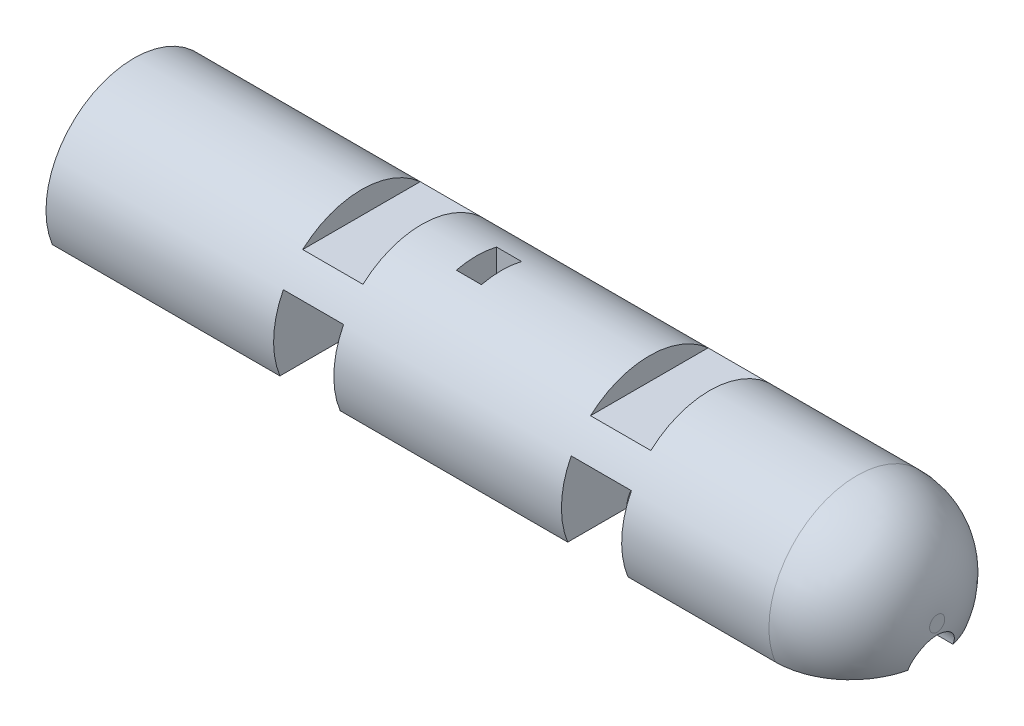
ISO-10303-21;
HEADER;
FILE_DESCRIPTION(('STEP AP214'),'2;1');
FILE_NAME('part.step','',(''),(''),'','','');
FILE_SCHEMA(('AUTOMOTIVE_DESIGN { 1 0 10303 214 1 1 1 1 }'));
ENDSEC;
DATA;
#1=APPLICATION_CONTEXT('core data for automotive mechanical design processes');
#2=APPLICATION_PROTOCOL_DEFINITION('international standard','automotive_design',2000,#1);
#3=PRODUCT_CONTEXT('',#1,'mechanical');
#4=PRODUCT('Part','Part','',(#3));
#5=PRODUCT_RELATED_PRODUCT_CATEGORY('part','',(#4));
#6=PRODUCT_DEFINITION_FORMATION('','',#4);
#7=PRODUCT_DEFINITION_CONTEXT('part definition',#1,'design');
#8=PRODUCT_DEFINITION('design','',#6,#7);
#9=PRODUCT_DEFINITION_SHAPE('','',#8);
#10=(LENGTH_UNIT() NAMED_UNIT(*) SI_UNIT(.MILLI.,.METRE.));
#11=(NAMED_UNIT(*) PLANE_ANGLE_UNIT() SI_UNIT($,.RADIAN.));
#12=(NAMED_UNIT(*) SI_UNIT($,.STERADIAN.) SOLID_ANGLE_UNIT());
#13=UNCERTAINTY_MEASURE_WITH_UNIT(LENGTH_MEASURE(1.E-05),#10,'distance_accuracy_value','');
#14=(GEOMETRIC_REPRESENTATION_CONTEXT(3) GLOBAL_UNCERTAINTY_ASSIGNED_CONTEXT((#13)) GLOBAL_UNIT_ASSIGNED_CONTEXT((#10,
#11,#12)) REPRESENTATION_CONTEXT('',''));
#15=CARTESIAN_POINT('',(0.,0.,0.));
#16=DIRECTION('',(0.,0.,1.));
#17=DIRECTION('',(1.,0.,0.));
#18=AXIS2_PLACEMENT_3D('',#15,#16,#17);
#19=CARTESIAN_POINT('',(0.,5.5,0.));
#20=DIRECTION('',(0.,1.,0.));
#21=DIRECTION('',(0.,0.,1.));
#22=AXIS2_PLACEMENT_3D('',#19,#20,#21);
#23=PLANE('',#22);
#24=DIRECTION('',(-1.,0.,0.));
#25=VECTOR('',#24,1.);
#26=CARTESIAN_POINT('',(80.01,5.5,6.51005000055557));
#27=LINE('',#26,#25);
#28=CARTESIAN_POINT('',(28.67,5.5,6.51005000055557));
#29=VERTEX_POINT('',#28);
#30=CARTESIAN_POINT('',(51.34,5.5,6.51005000055557));
#31=VERTEX_POINT('',#30);
#32=EDGE_CURVE('E269',#29,#31,#27,.F.);
#33=ORIENTED_EDGE('',*,*,#32,.F.);
#34=DIRECTION('',(0.,0.,1.));
#35=VECTOR('',#34,1.);
#36=CARTESIAN_POINT('',(28.67,5.5,17.52));
#37=LINE('',#36,#35);
#38=CARTESIAN_POINT('',(28.67,5.5,0.634581549236986));
#39=VERTEX_POINT('',#38);
#40=EDGE_CURVE('E272',#39,#29,#37,.T.);
#41=ORIENTED_EDGE('',*,*,#40,.F.);
#42=DIRECTION('',(-1.,0.,0.));
#43=VECTOR('',#42,1.);
#44=CARTESIAN_POINT('',(80.01,5.5,0.634581549236986));
#45=LINE('',#44,#43);
#46=CARTESIAN_POINT('',(51.34,5.5,0.634581549236986));
#47=VERTEX_POINT('',#46);
#48=EDGE_CURVE('E211',#39,#47,#45,.F.);
#49=ORIENTED_EDGE('',*,*,#48,.T.);
#50=DIRECTION('',(0.,0.,-1.));
#51=VECTOR('',#50,1.);
#52=CARTESIAN_POINT('',(51.34,5.5,17.52));
#53=LINE('',#52,#51);
#54=EDGE_CURVE('E274',#31,#47,#53,.T.);
#55=ORIENTED_EDGE('',*,*,#54,.F.);
#56=EDGE_LOOP('',(#33,#41,#49,#55));
#57=FACE_BOUND('',#56,.T.);
#58=ADVANCED_FACE('F42',(#57),#23,.F.);
#59=DIRECTION('',(-1.,0.,0.));
#60=VECTOR('',#59,1.);
#61=CARTESIAN_POINT('',(80.01,5.5,16.885418450763));
#62=LINE('',#61,#60);
#63=CARTESIAN_POINT('',(51.34,5.5,16.885418450763));
#64=VERTEX_POINT('',#63);
#65=CARTESIAN_POINT('',(28.67,5.5,16.885418450763));
#66=VERTEX_POINT('',#65);
#67=EDGE_CURVE('E407',#64,#66,#62,.T.);
#68=ORIENTED_EDGE('',*,*,#67,.T.);
#69=CARTESIAN_POINT('',(28.67,5.5,11.0099499994444));
#70=VERTEX_POINT('',#69);
#71=EDGE_CURVE('E320',#70,#66,#37,.T.);
#72=ORIENTED_EDGE('',*,*,#71,.F.);
#73=DIRECTION('',(-1.,0.,0.));
#74=VECTOR('',#73,1.);
#75=CARTESIAN_POINT('',(80.01,5.5,11.0099499994444));
#76=LINE('',#75,#74);
#77=CARTESIAN_POINT('',(51.34,5.5,11.0099499994444));
#78=VERTEX_POINT('',#77);
#79=EDGE_CURVE('E278',#78,#70,#76,.T.);
#80=ORIENTED_EDGE('',*,*,#79,.F.);
#81=EDGE_CURVE('E400',#64,#78,#53,.T.);
#82=ORIENTED_EDGE('',*,*,#81,.F.);
#83=EDGE_LOOP('',(#68,#72,#80,#82));
#84=FACE_BOUND('',#83,.T.);
#85=ADVANCED_FACE('F259',(#84),#23,.F.);
#86=CARTESIAN_POINT('',(22.67,5.5,16.885418450763));
#87=VERTEX_POINT('',#86);
#88=CARTESIAN_POINT('',(0.,5.5,16.885418450763));
#89=VERTEX_POINT('',#88);
#90=EDGE_CURVE('E47',#87,#89,#62,.T.);
#91=ORIENTED_EDGE('',*,*,#90,.T.);
#92=DIRECTION('',(0.,0.,-1.));
#93=VECTOR('',#92,1.);
#94=CARTESIAN_POINT('',(0.,5.5,17.52));
#95=LINE('',#94,#93);
#96=CARTESIAN_POINT('',(0.,5.5,0.634581549236986));
#97=VERTEX_POINT('',#96);
#98=EDGE_CURVE('E315',#89,#97,#95,.T.);
#99=ORIENTED_EDGE('',*,*,#98,.T.);
#100=CARTESIAN_POINT('',(22.67,5.5,0.634581549236986));
#101=VERTEX_POINT('',#100);
#102=EDGE_CURVE('E214',#97,#101,#45,.F.);
#103=ORIENTED_EDGE('',*,*,#102,.T.);
#104=DIRECTION('',(0.,0.,-1.));
#105=VECTOR('',#104,1.);
#106=CARTESIAN_POINT('',(22.67,5.5,17.52));
#107=LINE('',#106,#105);
#108=EDGE_CURVE('E318',#87,#101,#107,.T.);
#109=ORIENTED_EDGE('',*,*,#108,.F.);
#110=EDGE_LOOP('',(#91,#99,#103,#109));
#111=FACE_BOUND('',#110,.T.);
#112=ADVANCED_FACE('F264',(#111),#23,.F.);
#113=CARTESIAN_POINT('',(57.34,5.5,0.634581549236986));
#114=VERTEX_POINT('',#113);
#115=CARTESIAN_POINT('',(72.01,5.5,0.634581549236986));
#116=VERTEX_POINT('',#115);
#117=EDGE_CURVE('E206',#114,#116,#45,.F.);
#118=ORIENTED_EDGE('',*,*,#117,.T.);
#119=CARTESIAN_POINT('',(79.6076953742566,5.5,8.76));
#120=CARTESIAN_POINT('',(79.6077023309361,5.5,9.02837036371126));
#121=CARTESIAN_POINT('',(79.5968199968479,5.5,9.29679003492493));
#122=CARTESIAN_POINT('',(79.5527067564648,5.5,9.83186942900327));
#123=CARTESIAN_POINT('',(79.5194697068977,5.5,10.0985286477334));
#124=CARTESIAN_POINT('',(79.4294253808811,5.5,10.6277164957013));
#125=CARTESIAN_POINT('',(79.3726328725868,5.5,10.8902476062178));
#126=CARTESIAN_POINT('',(79.2344893147,5.5,11.4087351942514));
#127=CARTESIAN_POINT('',(79.1531466228046,5.5,11.6646938771143));
#128=CARTESIAN_POINT('',(78.983013750841,5.5,12.1205827524817));
#129=CARTESIAN_POINT('',(78.8984169333496,5.5,12.322085331011));
#130=CARTESIAN_POINT('',(78.7128787031022,5.5,12.7174152992263));
#131=CARTESIAN_POINT('',(78.6119392085858,5.5,12.9112435863717));
#132=CARTESIAN_POINT('',(78.3941329563667,5.5,13.2897037175507));
#133=CARTESIAN_POINT('',(78.2772684806355,5.5,13.4743368740348));
#134=CARTESIAN_POINT('',(78.0282333109941,5.5,13.8329879390141));
#135=CARTESIAN_POINT('',(77.8960623306653,5.5,14.0070056487777));
#136=CARTESIAN_POINT('',(77.6169989223127,5.5,14.3433346771138));
#137=CARTESIAN_POINT('',(77.4700808258599,5.5,14.5056247081087));
#138=CARTESIAN_POINT('',(77.1627255165891,5.5,14.8168525951596));
#139=CARTESIAN_POINT('',(77.0022885637375,5.5,14.9657907078582));
#140=CARTESIAN_POINT('',(76.6690279456885,5.5,15.2491323274769));
#141=CARTESIAN_POINT('',(76.4962031277762,5.5,15.3835344788708));
#142=CARTESIAN_POINT('',(76.1394587439955,5.5,15.6367021013726));
#143=CARTESIAN_POINT('',(75.9555394586154,5.5,15.7554679675529));
#144=CARTESIAN_POINT('',(75.5840728801009,5.5,15.9728482304509));
#145=CARTESIAN_POINT('',(75.3968329147818,5.5,16.0719882105933));
#146=CARTESIAN_POINT('',(75.0145293293788,5.5,16.2540097603268));
#147=CARTESIAN_POINT('',(74.8194630805038,5.5,16.3368858109749));
#148=CARTESIAN_POINT('',(74.4230730165867,5.5,16.4856718983966));
#149=CARTESIAN_POINT('',(74.2217523050191,5.5,16.5515902035644));
#150=CARTESIAN_POINT('',(73.8141457797776,5.5,16.6660363181715));
#151=CARTESIAN_POINT('',(73.6078581681981,5.5,16.7145577261799));
#152=CARTESIAN_POINT('',(73.1942612379451,5.5,16.793357429692));
#153=CARTESIAN_POINT('',(72.9869902324859,5.5,16.8238369612243));
#154=CARTESIAN_POINT('',(72.570536297232,5.5,16.8671893941509));
#155=CARTESIAN_POINT('',(72.3613526861674,5.5,16.8800557545266));
#156=CARTESIAN_POINT('',(71.9427338287219,5.5,16.8880634521312));
#157=CARTESIAN_POINT('',(71.7332987231721,5.5,16.8832121586811));
#158=CARTESIAN_POINT('',(71.3154920568877,5.5,16.8558307089543));
#159=CARTESIAN_POINT('',(71.107121019827,5.5,16.83329256052));
#160=CARTESIAN_POINT('',(70.6936025917873,5.5,16.7707815713613));
#161=CARTESIAN_POINT('',(70.4884478643462,5.5,16.7308572466667));
#162=CARTESIAN_POINT('',(70.0823202610352,5.5,16.6339003685537));
#163=CARTESIAN_POINT('',(69.8813455343825,5.5,16.5768755669352));
#164=CARTESIAN_POINT('',(69.4848316335242,5.5,16.4461077068488));
#165=CARTESIAN_POINT('',(69.2892944258595,5.5,16.3723586859316));
#166=CARTESIAN_POINT('',(68.9051771189548,5.5,16.2087273027153));
#167=CARTESIAN_POINT('',(68.7165944904671,5.5,16.1188508768105));
#168=CARTESIAN_POINT('',(68.347239393529,5.5,15.9234025387041));
#169=CARTESIAN_POINT('',(68.1664841552859,5.5,15.8177980672832));
#170=CARTESIAN_POINT('',(67.8145236883116,5.5,15.5918543659582));
#171=CARTESIAN_POINT('',(67.6433150611271,5.5,15.4715204289025));
#172=CARTESIAN_POINT('',(67.3114651731751,5.5,15.2169123290138));
#173=CARTESIAN_POINT('',(67.1508291625498,5.5,15.0826313244176));
#174=CARTESIAN_POINT('',(66.8413450962586,5.5,14.8012177565938));
#175=CARTESIAN_POINT('',(66.6924929654953,5.5,14.6540896734813));
#176=CARTESIAN_POINT('',(66.4062408461907,5.5,14.3466972848664));
#177=CARTESIAN_POINT('',(66.2689511346516,5.5,14.1863303002828));
#178=CARTESIAN_POINT('',(66.0081338510629,5.5,13.8547765902544));
#179=CARTESIAN_POINT('',(65.8846062623249,5.5,13.6835898779304));
#180=CARTESIAN_POINT('',(65.6520782342032,5.5,13.3317624329755));
#181=CARTESIAN_POINT('',(65.5430697318146,5.5,13.1511270258507));
#182=CARTESIAN_POINT('',(65.3400205895639,5.5,12.7816372852848));
#183=CARTESIAN_POINT('',(65.2459801640461,5.5,12.5927828341954));
#184=CARTESIAN_POINT('',(65.0708865856775,5.5,12.2030979503389));
#185=CARTESIAN_POINT('',(64.9902453279674,5.5,12.0020825936391));
#186=CARTESIAN_POINT('',(64.8451581363816,5.5,11.5943073668426));
#187=CARTESIAN_POINT('',(64.7807121686357,5.5,11.3875475087607));
#188=CARTESIAN_POINT('',(64.6677422936703,5.5,10.9694893295982));
#189=CARTESIAN_POINT('',(64.6192364400913,5.5,10.7581861492807));
#190=CARTESIAN_POINT('',(64.5377591243811,5.5,10.3326116361911));
#191=CARTESIAN_POINT('',(64.504788962277,5.5,10.1183400565673));
#192=CARTESIAN_POINT('',(64.4511250633583,5.5,9.66600848738885));
#193=CARTESIAN_POINT('',(64.4320336620135,5.5,9.42775885013463));
#194=CARTESIAN_POINT('',(64.4112355544718,5.5,8.950497483218));
#195=CARTESIAN_POINT('',(64.4095305259844,5.5,8.71148568223609));
#196=CARTESIAN_POINT('',(64.4234356959219,5.5,8.23385032167484));
#197=CARTESIAN_POINT('',(64.4390533936272,5.5,7.99522697506655));
#198=CARTESIAN_POINT('',(64.4882326155228,5.5,7.51982110574651));
#199=CARTESIAN_POINT('',(64.5217941617526,5.5,7.28303858529612));
#200=CARTESIAN_POINT('',(64.6136406387275,5.5,6.78064967739285));
#201=CARTESIAN_POINT('',(64.674682353132,5.5,6.51553765491161));
#202=CARTESIAN_POINT('',(64.8220773784337,5.5,5.99238154436173));
#203=CARTESIAN_POINT('',(64.9084329751479,5.5,5.73433809687986));
#204=CARTESIAN_POINT('',(65.1065802623455,5.5,5.22855696072308));
#205=CARTESIAN_POINT('',(65.2183393370527,5.5,4.98080653500178));
#206=CARTESIAN_POINT('',(65.4669030781019,5.5,4.49821469081062));
#207=CARTESIAN_POINT('',(65.6037033261558,5.5,4.26337100455301));
#208=CARTESIAN_POINT('',(65.878747243824,5.5,3.84380922373616));
#209=CARTESIAN_POINT('',(66.0136381698243,5.5,3.65688444817034));
#210=CARTESIAN_POINT('',(66.2997775509953,5.5,3.29600676983187));
#211=CARTESIAN_POINT('',(66.451024603721,5.5,3.12205275704747));
#212=CARTESIAN_POINT('',(66.7687670735896,5.5,2.78864161133379));
#213=CARTESIAN_POINT('',(66.9352641855355,5.5,2.6291860936165));
#214=CARTESIAN_POINT('',(67.2821807842605,5.5,2.32621389276423));
#215=CARTESIAN_POINT('',(67.4625998136151,5.5,2.18269668633075));
#216=CARTESIAN_POINT('',(67.8220794013123,5.5,1.92285940096926));
#217=CARTESIAN_POINT('',(68.0002554609646,5.5,1.80531333047753));
#218=CARTESIAN_POINT('',(68.3660042895672,5.5,1.58589093529027));
#219=CARTESIAN_POINT('',(68.5535766383489,5.5,1.48401391075836));
#220=CARTESIAN_POINT('',(68.9366936647261,5.5,1.29674316231642));
#221=CARTESIAN_POINT('',(69.1322354926056,5.5,1.21134360797376));
#222=CARTESIAN_POINT('',(69.5299283138085,5.5,1.05763694765287));
#223=CARTESIAN_POINT('',(69.7320793303315,5.5,0.989329901679742));
#224=CARTESIAN_POINT('',(70.138166052646,5.5,0.871302987910124));
#225=CARTESIAN_POINT('',(70.3420191294219,5.5,0.821298631703383));
#226=CARTESIAN_POINT('',(70.7532958124504,5.5,0.738695237554467));
#227=CARTESIAN_POINT('',(70.9607206183616,5.5,0.706102170182909));
#228=CARTESIAN_POINT('',(71.3775197773859,5.5,0.658597737653936));
#229=CARTESIAN_POINT('',(71.586893506247,5.5,0.643680894651801));
#230=CARTESIAN_POINT('',(72.0062300275939,5.5,0.631619167096186));
#231=CARTESIAN_POINT('',(72.2161930088503,5.5,0.634480838940165));
#232=CARTESIAN_POINT('',(72.6341203636616,5.5,0.657913888133056));
#233=CARTESIAN_POINT('',(72.8420894932414,5.5,0.678400544248534));
#234=CARTESIAN_POINT('',(73.2556400806789,5.5,0.736830146422631));
#235=CARTESIAN_POINT('',(73.461220620769,5.5,0.774779588697626));
#236=CARTESIAN_POINT('',(73.8683617984528,5.5,0.86783577784102));
#237=CARTESIAN_POINT('',(74.0699242289981,5.5,0.922934681317626));
#238=CARTESIAN_POINT('',(74.4677902227804,5.5,1.04991817969198));
#239=CARTESIAN_POINT('',(74.6640913713373,5.5,1.12181033967495));
#240=CARTESIAN_POINT('',(75.0500604968501,5.5,1.28187986833122));
#241=CARTESIAN_POINT('',(75.2397248589599,5.5,1.37006595249154));
#242=CARTESIAN_POINT('',(75.6108980372724,5.5,1.56200434622037));
#243=CARTESIAN_POINT('',(75.792410448237,5.5,1.66574970527858));
#244=CARTESIAN_POINT('',(76.1461865005296,5.5,1.8881182409424));
#245=CARTESIAN_POINT('',(76.3184462108656,5.5,2.00674767072656));
#246=CARTESIAN_POINT('',(76.6523963730252,5.5,2.25793041989117));
#247=CARTESIAN_POINT('',(76.8140905887795,5.5,2.39047873634663));
#248=CARTESIAN_POINT('',(77.1268758837295,5.5,2.66943382448424));
#249=CARTESIAN_POINT('',(77.2778940126476,5.5,2.8159223858914));
#250=CARTESIAN_POINT('',(77.5671613024183,5.5,3.12090630836931));
#251=CARTESIAN_POINT('',(77.7054148244894,5.5,3.27939753461002));
#252=CARTESIAN_POINT('',(77.9683921606876,5.5,3.60730864427168));
#253=CARTESIAN_POINT('',(78.0931118157995,5.5,3.77673186177828));
#254=CARTESIAN_POINT('',(78.3282223198821,5.5,4.12515830649314));
#255=CARTESIAN_POINT('',(78.4386177297412,5.5,4.30415845860804));
#256=CARTESIAN_POINT('',(78.6466065165115,5.5,4.67407731785711));
#257=CARTESIAN_POINT('',(78.7439066423087,5.5,4.86516084157995));
#258=CARTESIAN_POINT('',(78.9227413170203,5.5,5.25456166631871));
#259=CARTESIAN_POINT('',(79.0042753453133,5.5,5.45287920595627));
#260=CARTESIAN_POINT('',(79.1514241647374,5.5,5.85519641806213));
#261=CARTESIAN_POINT('',(79.2170482246808,5.5,6.05919270460763));
#262=CARTESIAN_POINT('',(79.3325966782146,5.5,6.47151996653132));
#263=CARTESIAN_POINT('',(79.3825225664344,5.5,6.67985052722657));
#264=CARTESIAN_POINT('',(79.4867765579149,5.5,7.19709082030436));
#265=CARTESIAN_POINT('',(79.5323912371054,5.5,7.50780060457313));
#266=CARTESIAN_POINT('',(79.5777172244861,5.5,7.97606786034412));
#267=CARTESIAN_POINT('',(79.5889763225878,5.5,8.1326347839779));
#268=CARTESIAN_POINT('',(79.6039631498456,5.5,8.44612886471213));
#269=CARTESIAN_POINT('',(79.6076913059642,5.5,8.60305600088548));
#270=CARTESIAN_POINT('',(79.6076953742566,5.5,8.76));
#271=B_SPLINE_CURVE_WITH_KNOTS('',3,(#119,#120,#121,#122,#123,#124,#125,#126,#127,#128,#129,
#130,#131,#132,#133,#134,#135,#136,#137,#138,#139,#140,#141,#142,#143,#144,#145,#146,#147,#148,
#149,#150,#151,#152,#153,#154,#155,#156,#157,#158,#159,#160,#161,#162,#163,#164,#165,#166,#167,
#168,#169,#170,#171,#172,#173,#174,#175,#176,#177,#178,#179,#180,#181,#182,#183,#184,#185,#186,
#187,#188,#189,#190,#191,#192,#193,#194,#195,#196,#197,#198,#199,#200,#201,#202,#203,#204,#205,
#206,#207,#208,#209,#210,#211,#212,#213,#214,#215,#216,#217,#218,#219,#220,#221,#222,#223,#224,
#225,#226,#227,#228,#229,#230,#231,#232,#233,#234,#235,#236,#237,#238,#239,#240,#241,#242,#243,
#244,#245,#246,#247,#248,#249,#250,#251,#252,#253,#254,#255,#256,#257,#258,#259,#260,#261,#262,
#263,#264,#265,#266,#267,#268,#269,#270),.UNSPECIFIED.,.T.,.F.,(4,2,2,2,2,2,2,2,2,2,2,2,2,2,2,2,
2,2,2,2,2,2,2,2,2,2,2,2,2,2,2,2,2,2,2,2,2,2,2,2,2,2,2,2,2,2,2,2,2,2,2,2,2,2,2,2,2,2,2,2,2,2,2,2,
2,2,2,2,2,2,2,2,2,2,2,4),(0.,0.80496675937522,1.61015482112021,2.41483882939646,
3.21924920494103,3.87416733633762,4.52900865165891,5.1837562299196,5.83851606193625,
6.49443599233153,7.15034331232582,7.80631174519797,8.46226360093292,9.09710181674111,
9.73215508516452,10.3668981197933,11.0018744778508,11.6296280228386,12.2576146340159,
12.8853400758669,13.5133493314057,14.1396172488814,14.7656017015312,15.3918096794026,
16.0177876252193,16.6450799225662,17.2721474684102,17.8995240895493,18.5266827950546,
19.1592699321369,19.7918563021188,20.42408989476,21.0563325402399,21.7053891303664,
22.3544443630746,23.0042321969112,23.6540743953655,24.3704437794031,25.0868822893209,
25.8036310778276,26.5203807466862,27.3353065022412,28.1503058674153,28.9642646987922,
29.7780800526985,30.4687126265365,31.1592860294354,31.8499362719834,32.5405638318812,
33.1801653827535,33.8197383584015,34.4590846091132,35.0984331042873,35.7273732740088,
36.3565289777532,36.9854896557249,37.6146822968808,38.2408672745985,38.867285383828,
39.493417417545,40.1198320592468,40.7465827401491,41.3730542735476,41.9997898905393,
42.6263010033743,43.2567458928364,43.8869745780511,44.5173963900285,45.1476169783934,
45.7901870119126,46.4327782604829,47.0749942444751,47.7171490642893,48.6573740877274,
49.1281483703442,49.5988959619319),.UNSPECIFIED.);
#272=CARTESIAN_POINT('',(79.3394800276012,5.50000000000008,6.51005000055557));
#273=VERTEX_POINT('',#272);
#274=EDGE_CURVE('E193',#116,#273,#271,.T.);
#275=ORIENTED_EDGE('',*,*,#274,.T.);
#276=DIRECTION('',(-1.,0.,0.));
#277=VECTOR('',#276,1.);
#278=CARTESIAN_POINT('',(80.01,5.5,6.51005000055557));
#279=LINE('',#278,#277);
#280=CARTESIAN_POINT('',(57.34,5.5,6.51005000055557));
#281=VERTEX_POINT('',#280);
#282=EDGE_CURVE('E319',#281,#273,#279,.F.);
#283=ORIENTED_EDGE('',*,*,#282,.F.);
#284=DIRECTION('',(0.,0.,1.));
#285=VECTOR('',#284,1.);
#286=CARTESIAN_POINT('',(57.34,5.5,17.52));
#287=LINE('',#286,#285);
#288=EDGE_CURVE('E208',#114,#281,#287,.T.);
#289=ORIENTED_EDGE('',*,*,#288,.F.);
#290=EDGE_LOOP('',(#118,#275,#283,#289));
#291=FACE_BOUND('',#290,.T.);
#292=ADVANCED_FACE('F207',(#291),#23,.F.);
#293=CARTESIAN_POINT('',(72.01,5.5,16.885418450763));
#294=VERTEX_POINT('',#293);
#295=CARTESIAN_POINT('',(57.34,5.5,16.885418450763));
#296=VERTEX_POINT('',#295);
#297=EDGE_CURVE('E212',#294,#296,#62,.T.);
#298=ORIENTED_EDGE('',*,*,#297,.T.);
#299=CARTESIAN_POINT('',(57.34,5.5,11.0099499994444));
#300=VERTEX_POINT('',#299);
#301=EDGE_CURVE('E401',#300,#296,#287,.T.);
#302=ORIENTED_EDGE('',*,*,#301,.F.);
#303=DIRECTION('',(-1.,0.,0.));
#304=VECTOR('',#303,1.);
#305=CARTESIAN_POINT('',(80.01,5.5,11.0099499994444));
#306=LINE('',#305,#304);
#307=CARTESIAN_POINT('',(79.3394800276087,5.50000000002092,11.0099499994446));
#308=VERTEX_POINT('',#307);
#309=EDGE_CURVE('E295',#308,#300,#306,.T.);
#310=ORIENTED_EDGE('',*,*,#309,.F.);
#311=EDGE_CURVE('E203',#308,#294,#271,.T.);
#312=ORIENTED_EDGE('',*,*,#311,.T.);
#313=EDGE_LOOP('',(#298,#302,#310,#312));
#314=FACE_BOUND('',#313,.T.);
#315=ADVANCED_FACE('F239',(#314),#23,.F.);
#316=CARTESIAN_POINT('',(51.34,15.27,17.52));
#317=DIRECTION('',(-1.,0.,0.));
#318=DIRECTION('',(0.,0.,1.));
#319=AXIS2_PLACEMENT_3D('',#316,#317,#318);
#320=PLANE('',#319);
#321=CARTESIAN_POINT('',(51.34,8.76,8.76));
#322=DIRECTION('',(-1.,0.,0.));
#323=DIRECTION('',(0.,0.,1.));
#324=AXIS2_PLACEMENT_3D('',#321,#322,#323);
#325=CIRCLE('',#324,8.755);
#326=CARTESIAN_POINT('',(51.34,15.27,14.6140520154847));
#327=VERTEX_POINT('',#326);
#328=CARTESIAN_POINT('',(51.34,15.27,2.90594798451533));
#329=VERTEX_POINT('',#328);
#330=EDGE_CURVE('E341',#327,#329,#325,.T.);
#331=ORIENTED_EDGE('',*,*,#330,.F.);
#332=DIRECTION('',(0.,0.,-1.));
#333=VECTOR('',#332,1.);
#334=CARTESIAN_POINT('',(51.34,15.27,17.52));
#335=LINE('',#334,#333);
#336=EDGE_CURVE('E382',#327,#329,#335,.T.);
#337=ORIENTED_EDGE('',*,*,#336,.T.);
#338=EDGE_LOOP('',(#331,#337));
#339=FACE_BOUND('',#338,.T.);
#340=ADVANCED_FACE('F243',(#339),#320,.F.);
#341=CARTESIAN_POINT('',(51.34,15.27,17.52));
#342=DIRECTION('',(0.,1.,0.));
#343=DIRECTION('',(0.,0.,1.));
#344=AXIS2_PLACEMENT_3D('',#341,#342,#343);
#345=PLANE('',#344);
#346=DIRECTION('',(0.,0.,-1.));
#347=VECTOR('',#346,1.);
#348=CARTESIAN_POINT('',(57.34,15.27,17.52));
#349=LINE('',#348,#347);
#350=CARTESIAN_POINT('',(57.34,15.27,14.6140520154847));
#351=VERTEX_POINT('',#350);
#352=CARTESIAN_POINT('',(57.34,15.27,2.90594798451533));
#353=VERTEX_POINT('',#352);
#354=EDGE_CURVE('E379',#351,#353,#349,.T.);
#355=ORIENTED_EDGE('',*,*,#354,.T.);
#356=DIRECTION('',(-1.,0.,0.));
#357=VECTOR('',#356,1.);
#358=CARTESIAN_POINT('',(80.01,15.27,2.90594798451533));
#359=LINE('',#358,#357);
#360=EDGE_CURVE('E346',#353,#329,#359,.T.);
#361=ORIENTED_EDGE('',*,*,#360,.T.);
#362=ORIENTED_EDGE('',*,*,#336,.F.);
#363=DIRECTION('',(-1.,0.,0.));
#364=VECTOR('',#363,1.);
#365=CARTESIAN_POINT('',(80.01,15.27,14.6140520154847));
#366=LINE('',#365,#364);
#367=EDGE_CURVE('E343',#327,#351,#366,.F.);
#368=ORIENTED_EDGE('',*,*,#367,.T.);
#369=EDGE_LOOP('',(#355,#361,#362,#368));
#370=FACE_BOUND('',#369,.T.);
#371=ADVANCED_FACE('F481',(#370),#345,.T.);
#372=CARTESIAN_POINT('',(57.34,17.52,17.52));
#373=DIRECTION('',(1.,0.,0.));
#374=DIRECTION('',(0.,0.,-1.));
#375=AXIS2_PLACEMENT_3D('',#372,#373,#374);
#376=PLANE('',#375);
#377=CARTESIAN_POINT('',(57.34,8.76,8.76));
#378=DIRECTION('',(1.,0.,0.));
#379=DIRECTION('',(0.,0.,-1.));
#380=AXIS2_PLACEMENT_3D('',#377,#378,#379);
#381=CIRCLE('',#380,8.755);
#382=EDGE_CURVE('E349',#353,#351,#381,.T.);
#383=ORIENTED_EDGE('',*,*,#382,.F.);
#384=ORIENTED_EDGE('',*,*,#354,.F.);
#385=EDGE_LOOP('',(#383,#384));
#386=FACE_BOUND('',#385,.T.);
#387=ADVANCED_FACE('F484',(#386),#376,.F.);
#388=CARTESIAN_POINT('',(22.67,17.52,17.52));
#389=DIRECTION('',(1.,0.,0.));
#390=DIRECTION('',(0.,1.,0.));
#391=AXIS2_PLACEMENT_3D('',#388,#389,#390);
#392=PLANE('',#391);
#393=DIRECTION('',(0.,0.,-1.));
#394=VECTOR('',#393,1.);
#395=CARTESIAN_POINT('',(22.67,15.27,17.52));
#396=LINE('',#395,#394);
#397=CARTESIAN_POINT('',(22.67,15.27,14.6140520154847));
#398=VERTEX_POINT('',#397);
#399=CARTESIAN_POINT('',(22.67,15.27,2.90594798451534));
#400=VERTEX_POINT('',#399);
#401=EDGE_CURVE('E314',#398,#400,#396,.T.);
#402=ORIENTED_EDGE('',*,*,#401,.T.);
#403=CARTESIAN_POINT('',(22.67,8.76,8.76));
#404=DIRECTION('',(1.,0.,0.));
#405=DIRECTION('',(0.,1.,0.));
#406=AXIS2_PLACEMENT_3D('',#403,#404,#405);
#407=CIRCLE('',#406,8.755);
#408=EDGE_CURVE('E220',#400,#398,#407,.T.);
#409=ORIENTED_EDGE('',*,*,#408,.T.);
#410=EDGE_LOOP('',(#402,#409));
#411=FACE_BOUND('',#410,.T.);
#412=ADVANCED_FACE('F473',(#411),#392,.T.);
#413=CARTESIAN_POINT('',(22.67,15.27,17.52));
#414=DIRECTION('',(0.,1.,0.));
#415=DIRECTION('',(-1.,0.,0.));
#416=AXIS2_PLACEMENT_3D('',#413,#414,#415);
#417=PLANE('',#416);
#418=DIRECTION('',(0.,0.,-1.));
#419=VECTOR('',#418,1.);
#420=CARTESIAN_POINT('',(28.67,15.27,17.52));
#421=LINE('',#420,#419);
#422=CARTESIAN_POINT('',(28.67,15.27,14.6140520154846));
#423=VERTEX_POINT('',#422);
#424=CARTESIAN_POINT('',(28.67,15.27,2.90594798451536));
#425=VERTEX_POINT('',#424);
#426=EDGE_CURVE('E385',#423,#425,#421,.T.);
#427=ORIENTED_EDGE('',*,*,#426,.T.);
#428=DIRECTION('',(-1.,0.,0.));
#429=VECTOR('',#428,1.);
#430=CARTESIAN_POINT('',(80.01,15.27,2.90594798451536));
#431=LINE('',#430,#429);
#432=EDGE_CURVE('E336',#425,#400,#431,.T.);
#433=ORIENTED_EDGE('',*,*,#432,.T.);
#434=ORIENTED_EDGE('',*,*,#401,.F.);
#435=DIRECTION('',(-1.,0.,0.));
#436=VECTOR('',#435,1.);
#437=CARTESIAN_POINT('',(80.01,15.27,14.6140520154846));
#438=LINE('',#437,#436);
#439=EDGE_CURVE('E304',#398,#423,#438,.F.);
#440=ORIENTED_EDGE('',*,*,#439,.T.);
#441=EDGE_LOOP('',(#427,#433,#434,#440));
#442=FACE_BOUND('',#441,.T.);
#443=ADVANCED_FACE('F459',(#442),#417,.T.);
#444=CARTESIAN_POINT('',(28.67,17.52,17.52));
#445=DIRECTION('',(1.,0.,0.));
#446=DIRECTION('',(0.,0.,-1.));
#447=AXIS2_PLACEMENT_3D('',#444,#445,#446);
#448=PLANE('',#447);
#449=CARTESIAN_POINT('',(28.67,8.76,8.76));
#450=DIRECTION('',(1.,0.,0.));
#451=DIRECTION('',(0.,0.,-1.));
#452=AXIS2_PLACEMENT_3D('',#449,#450,#451);
#453=CIRCLE('',#452,8.755);
#454=EDGE_CURVE('E339',#425,#423,#453,.T.);
#455=ORIENTED_EDGE('',*,*,#454,.F.);
#456=ORIENTED_EDGE('',*,*,#426,.F.);
#457=EDGE_LOOP('',(#455,#456));
#458=FACE_BOUND('',#457,.T.);
#459=ADVANCED_FACE('F455',(#458),#448,.F.);
#460=CARTESIAN_POINT('',(36.6138540259674,17.515,10.7590520154847));
#461=DIRECTION('',(-1.,0.,0.));
#462=DIRECTION('',(0.,0.,1.));
#463=AXIS2_PLACEMENT_3D('',#460,#461,#462);
#464=PLANE('',#463);
#465=DIRECTION('',(0.,-1.,0.));
#466=VECTOR('',#465,1.);
#467=CARTESIAN_POINT('',(36.6138540259674,17.515,6.75905201548466));
#468=LINE('',#467,#466);
#469=CARTESIAN_POINT('',(36.6138540259674,17.2832759056166,6.75905201548466));
#470=VERTEX_POINT('',#469);
#471=CARTESIAN_POINT('',(36.6138540259674,6.54393496551727,6.75905201548466));
#472=VERTEX_POINT('',#471);
#473=EDGE_CURVE('E11',#470,#472,#468,.T.);
#474=ORIENTED_EDGE('',*,*,#473,.T.);
#475=CARTESIAN_POINT('',(36.6138540259674,5.515,8.76));
#476=DIRECTION('',(-1.,0.,0.));
#477=DIRECTION('',(0.,0.,1.));
#478=AXIS2_PLACEMENT_3D('',#475,#476,#477);
#479=CIRCLE('',#478,2.25);
#480=CARTESIAN_POINT('',(36.6138540259674,6.54761369320124,10.7590520154847));
#481=VERTEX_POINT('',#480);
#482=EDGE_CURVE('E64',#472,#481,#479,.F.);
#483=ORIENTED_EDGE('',*,*,#482,.T.);
#484=DIRECTION('',(0.,-1.,0.));
#485=VECTOR('',#484,1.);
#486=CARTESIAN_POINT('',(36.6138540259674,17.515,10.7590520154847));
#487=LINE('',#486,#485);
#488=CARTESIAN_POINT('',(36.6138540259674,17.2837207860996,10.7590520154847));
#489=VERTEX_POINT('',#488);
#490=EDGE_CURVE('E52',#489,#481,#487,.T.);
#491=ORIENTED_EDGE('',*,*,#490,.F.);
#492=CARTESIAN_POINT('',(36.6138540259674,8.76,8.76));
#493=DIRECTION('',(-1.,0.,0.));
#494=DIRECTION('',(0.,0.,1.));
#495=AXIS2_PLACEMENT_3D('',#492,#493,#494);
#496=CIRCLE('',#495,8.755);
#497=EDGE_CURVE('E59',#470,#489,#496,.F.);
#498=ORIENTED_EDGE('',*,*,#497,.F.);
#499=EDGE_LOOP('',(#474,#483,#491,#498));
#500=FACE_BOUND('',#499,.T.);
#501=ADVANCED_FACE('F452',(#500),#464,.T.);
#502=CARTESIAN_POINT('',(34.1138540259674,17.515,10.7590520154847));
#503=DIRECTION('',(0.,0.,-1.));
#504=DIRECTION('',(-1.,0.,0.));
#505=AXIS2_PLACEMENT_3D('',#502,#503,#504);
#506=PLANE('',#505);
#507=ORIENTED_EDGE('',*,*,#490,.T.);
#508=DIRECTION('',(-1.,0.,0.));
#509=VECTOR('',#508,1.);
#510=CARTESIAN_POINT('',(80.01,6.54761369320124,10.7590520154847));
#511=LINE('',#510,#509);
#512=CARTESIAN_POINT('',(34.1138540259674,6.54761369320124,10.7590520154847));
#513=VERTEX_POINT('',#512);
#514=EDGE_CURVE('E391',#481,#513,#511,.T.);
#515=ORIENTED_EDGE('',*,*,#514,.T.);
#516=DIRECTION('',(0.,-1.,0.));
#517=VECTOR('',#516,1.);
#518=CARTESIAN_POINT('',(34.1138540259674,17.515,10.7590520154847));
#519=LINE('',#518,#517);
#520=CARTESIAN_POINT('',(34.1138540259674,17.2837207860996,10.7590520154847));
#521=VERTEX_POINT('',#520);
#522=EDGE_CURVE('E323',#521,#513,#519,.T.);
#523=ORIENTED_EDGE('',*,*,#522,.F.);
#524=DIRECTION('',(-1.,0.,0.));
#525=VECTOR('',#524,1.);
#526=CARTESIAN_POINT('',(80.01,17.2837207860996,10.7590520154847));
#527=LINE('',#526,#525);
#528=EDGE_CURVE('E330',#489,#521,#527,.T.);
#529=ORIENTED_EDGE('',*,*,#528,.F.);
#530=EDGE_LOOP('',(#507,#515,#523,#529));
#531=FACE_BOUND('',#530,.T.);
#532=ADVANCED_FACE('F448',(#531),#506,.T.);
#533=CARTESIAN_POINT('',(34.1138540259674,17.515,6.75905201548466));
#534=DIRECTION('',(1.,0.,0.));
#535=DIRECTION('',(0.,0.,-1.));
#536=AXIS2_PLACEMENT_3D('',#533,#534,#535);
#537=PLANE('',#536);
#538=ORIENTED_EDGE('',*,*,#522,.T.);
#539=CARTESIAN_POINT('',(34.1138540259674,5.515,8.76));
#540=DIRECTION('',(1.,0.,0.));
#541=DIRECTION('',(0.,0.,-1.));
#542=AXIS2_PLACEMENT_3D('',#539,#540,#541);
#543=CIRCLE('',#542,2.25);
#544=CARTESIAN_POINT('',(34.1138540259674,6.54393496551727,6.75905201548466));
#545=VERTEX_POINT('',#544);
#546=EDGE_CURVE('E393',#513,#545,#543,.F.);
#547=ORIENTED_EDGE('',*,*,#546,.T.);
#548=DIRECTION('',(0.,-1.,0.));
#549=VECTOR('',#548,1.);
#550=CARTESIAN_POINT('',(34.1138540259674,17.515,6.75905201548466));
#551=LINE('',#550,#549);
#552=CARTESIAN_POINT('',(34.1138540259674,17.2832759056166,6.75905201548466));
#553=VERTEX_POINT('',#552);
#554=EDGE_CURVE('E326',#553,#545,#551,.T.);
#555=ORIENTED_EDGE('',*,*,#554,.F.);
#556=CARTESIAN_POINT('',(34.1138540259674,8.76,8.76));
#557=DIRECTION('',(1.,0.,0.));
#558=DIRECTION('',(0.,0.,-1.));
#559=AXIS2_PLACEMENT_3D('',#556,#557,#558);
#560=CIRCLE('',#559,8.755);
#561=EDGE_CURVE('E290',#521,#553,#560,.F.);
#562=ORIENTED_EDGE('',*,*,#561,.F.);
#563=EDGE_LOOP('',(#538,#547,#555,#562));
#564=FACE_BOUND('',#563,.T.);
#565=ADVANCED_FACE('F436',(#564),#537,.T.);
#566=CARTESIAN_POINT('',(34.1138540259674,17.515,6.75905201548466));
#567=DIRECTION('',(0.,0.,1.));
#568=DIRECTION('',(1.,0.,0.));
#569=AXIS2_PLACEMENT_3D('',#566,#567,#568);
#570=PLANE('',#569);
#571=ORIENTED_EDGE('',*,*,#554,.T.);
#572=DIRECTION('',(-1.,0.,0.));
#573=VECTOR('',#572,1.);
#574=CARTESIAN_POINT('',(80.01,6.54393496551724,6.75905201548465));
#575=LINE('',#574,#573);
#576=EDGE_CURVE('E395',#545,#472,#575,.F.);
#577=ORIENTED_EDGE('',*,*,#576,.T.);
#578=ORIENTED_EDGE('',*,*,#473,.F.);
#579=DIRECTION('',(-1.,0.,0.));
#580=VECTOR('',#579,1.);
#581=CARTESIAN_POINT('',(80.01,17.2832759056166,6.75905201548465));
#582=LINE('',#581,#580);
#583=EDGE_CURVE('E287',#553,#470,#582,.F.);
#584=ORIENTED_EDGE('',*,*,#583,.F.);
#585=EDGE_LOOP('',(#571,#577,#578,#584));
#586=FACE_BOUND('',#585,.T.);
#587=ADVANCED_FACE('F431',(#586),#570,.T.);
#588=CARTESIAN_POINT('',(51.34,12.77,17.52));
#589=DIRECTION('',(0.,1.,0.));
#590=DIRECTION('',(0.,0.,1.));
#591=AXIS2_PLACEMENT_3D('',#588,#589,#590);
#592=PLANE('',#591);
#593=DIRECTION('',(-1.,0.,0.));
#594=VECTOR('',#593,1.);
#595=CARTESIAN_POINT('',(80.01,12.77,0.97733175575368));
#596=LINE('',#595,#594);
#597=CARTESIAN_POINT('',(57.34,12.77,0.97733175575368));
#598=VERTEX_POINT('',#597);
#599=CARTESIAN_POINT('',(51.34,12.77,0.97733175575368));
#600=VERTEX_POINT('',#599);
#601=EDGE_CURVE('E354',#598,#600,#596,.T.);
#602=ORIENTED_EDGE('',*,*,#601,.F.);
#603=DIRECTION('',(0.,0.,-1.));
#604=VECTOR('',#603,1.);
#605=CARTESIAN_POINT('',(57.34,12.77,17.52));
#606=LINE('',#605,#604);
#607=CARTESIAN_POINT('',(57.34,12.77,16.5426682442463));
#608=VERTEX_POINT('',#607);
#609=EDGE_CURVE('E376',#608,#598,#606,.T.);
#610=ORIENTED_EDGE('',*,*,#609,.F.);
#611=DIRECTION('',(-1.,0.,0.));
#612=VECTOR('',#611,1.);
#613=CARTESIAN_POINT('',(80.01,12.77,16.5426682442463));
#614=LINE('',#613,#612);
#615=CARTESIAN_POINT('',(51.34,12.77,16.5426682442463));
#616=VERTEX_POINT('',#615);
#617=EDGE_CURVE('E352',#616,#608,#614,.F.);
#618=ORIENTED_EDGE('',*,*,#617,.F.);
#619=DIRECTION('',(0.,0.,-1.));
#620=VECTOR('',#619,1.);
#621=CARTESIAN_POINT('',(51.34,12.77,17.52));
#622=LINE('',#621,#620);
#623=EDGE_CURVE('E373',#616,#600,#622,.T.);
#624=ORIENTED_EDGE('',*,*,#623,.T.);
#625=EDGE_LOOP('',(#602,#610,#618,#624));
#626=FACE_BOUND('',#625,.T.);
#627=ADVANCED_FACE('F413',(#626),#592,.F.);
#628=CARTESIAN_POINT('',(80.01,5.515,8.76));
#629=DIRECTION('',(-1.,0.,0.));
#630=DIRECTION('',(0.,0.,1.));
#631=AXIS2_PLACEMENT_3D('',#628,#629,#630);
#632=CYLINDRICAL_SURFACE('',#631,2.25);
#633=CARTESIAN_POINT('',(28.67,5.515,8.76));
#634=DIRECTION('',(-1.,0.,0.));
#635=DIRECTION('',(0.,0.,1.));
#636=AXIS2_PLACEMENT_3D('',#633,#634,#635);
#637=CIRCLE('',#636,2.25);
#638=EDGE_CURVE('E281',#70,#29,#637,.T.);
#639=ORIENTED_EDGE('',*,*,#638,.T.);
#640=ORIENTED_EDGE('',*,*,#32,.T.);
#641=CARTESIAN_POINT('',(51.34,5.515,8.76));
#642=DIRECTION('',(-1.,0.,0.));
#643=DIRECTION('',(0.,0.,1.));
#644=AXIS2_PLACEMENT_3D('',#641,#642,#643);
#645=CIRCLE('',#644,2.25);
#646=EDGE_CURVE('E292',#78,#31,#645,.T.);
#647=ORIENTED_EDGE('',*,*,#646,.F.);
#648=ORIENTED_EDGE('',*,*,#79,.T.);
#649=EDGE_LOOP('',(#639,#640,#647,#648));
#650=FACE_BOUND('',#649,.T.);
#651=ORIENTED_EDGE('',*,*,#576,.F.);
#652=ORIENTED_EDGE('',*,*,#546,.F.);
#653=ORIENTED_EDGE('',*,*,#514,.F.);
#654=ORIENTED_EDGE('',*,*,#482,.F.);
#655=EDGE_LOOP('',(#651,#652,#653,#654));
#656=FACE_BOUND('',#655,.T.);
#657=ADVANCED_FACE('F282',(#650,#656),#632,.F.);
#658=CARTESIAN_POINT('',(22.67,12.77,17.52));
#659=DIRECTION('',(0.,1.,0.));
#660=DIRECTION('',(-1.,0.,0.));
#661=AXIS2_PLACEMENT_3D('',#658,#659,#660);
#662=PLANE('',#661);
#663=DIRECTION('',(-1.,0.,0.));
#664=VECTOR('',#663,1.);
#665=CARTESIAN_POINT('',(80.01,12.77,0.977331755753675));
#666=LINE('',#665,#664);
#667=CARTESIAN_POINT('',(28.67,12.77,0.977331755753682));
#668=VERTEX_POINT('',#667);
#669=CARTESIAN_POINT('',(22.67,12.77,0.977331755753675));
#670=VERTEX_POINT('',#669);
#671=EDGE_CURVE('E366',#668,#670,#666,.T.);
#672=ORIENTED_EDGE('',*,*,#671,.F.);
#673=DIRECTION('',(0.,0.,-1.));
#674=VECTOR('',#673,1.);
#675=CARTESIAN_POINT('',(28.67,12.77,17.52));
#676=LINE('',#675,#674);
#677=CARTESIAN_POINT('',(28.67,12.77,16.5426682442463));
#678=VERTEX_POINT('',#677);
#679=EDGE_CURVE('E370',#678,#668,#676,.T.);
#680=ORIENTED_EDGE('',*,*,#679,.F.);
#681=DIRECTION('',(-1.,0.,0.));
#682=VECTOR('',#681,1.);
#683=CARTESIAN_POINT('',(80.01,12.77,16.5426682442463));
#684=LINE('',#683,#682);
#685=CARTESIAN_POINT('',(22.67,12.77,16.5426682442463));
#686=VERTEX_POINT('',#685);
#687=EDGE_CURVE('E364',#686,#678,#684,.F.);
#688=ORIENTED_EDGE('',*,*,#687,.F.);
#689=DIRECTION('',(0.,0.,-1.));
#690=VECTOR('',#689,1.);
#691=CARTESIAN_POINT('',(22.67,12.77,17.52));
#692=LINE('',#691,#690);
#693=EDGE_CURVE('E224',#686,#670,#692,.T.);
#694=ORIENTED_EDGE('',*,*,#693,.T.);
#695=EDGE_LOOP('',(#672,#680,#688,#694));
#696=FACE_BOUND('',#695,.T.);
#697=ADVANCED_FACE('F255',(#696),#662,.F.);
#698=CARTESIAN_POINT('',(80.01,0.,17.52));
#699=DIRECTION('',(-1.,0.,0.));
#700=DIRECTION('',(0.,0.,1.));
#701=AXIS2_PLACEMENT_3D('',#698,#699,#700);
#702=PLANE('',#701);
#703=CARTESIAN_POINT('',(80.01,8.76,8.76));
#704=DIRECTION('',(-1.,0.,0.));
#705=DIRECTION('',(0.,0.,1.));
#706=AXIS2_PLACEMENT_3D('',#703,#704,#705);
#707=CIRCLE('',#706,0.755000000000002);
#708=CARTESIAN_POINT('',(80.01,8.76,9.515));
#709=VERTEX_POINT('',#708);
#710=EDGE_CURVE('E221',#709,#709,#707,.F.);
#711=ORIENTED_EDGE('',*,*,#710,.T.);
#712=EDGE_LOOP('',(#711));
#713=FACE_BOUND('',#712,.T.);
#714=ADVANCED_FACE('F249',(#713),#702,.F.);
#715=CARTESIAN_POINT('',(80.01,8.76,8.76));
#716=DIRECTION('',(-1.,0.,0.));
#717=DIRECTION('',(0.,0.,1.));
#718=AXIS2_PLACEMENT_3D('',#715,#716,#717);
#719=CYLINDRICAL_SURFACE('',#718,8.755);
#720=ORIENTED_EDGE('',*,*,#102,.F.);
#721=CARTESIAN_POINT('',(0.,8.76,8.76));
#722=DIRECTION('',(-1.,0.,0.));
#723=DIRECTION('',(0.,0.,1.));
#724=AXIS2_PLACEMENT_3D('',#721,#722,#723);
#725=CIRCLE('',#724,8.755);
#726=EDGE_CURVE('E300',#89,#97,#725,.T.);
#727=ORIENTED_EDGE('',*,*,#726,.F.);
#728=ORIENTED_EDGE('',*,*,#90,.F.);
#729=CARTESIAN_POINT('',(22.67,8.76,8.76));
#730=DIRECTION('',(-1.,0.,0.));
#731=DIRECTION('',(0.,0.,1.));
#732=AXIS2_PLACEMENT_3D('',#729,#730,#731);
#733=CIRCLE('',#732,8.755);
#734=EDGE_CURVE('E313',#87,#686,#733,.T.);
#735=ORIENTED_EDGE('',*,*,#734,.T.);
#736=ORIENTED_EDGE('',*,*,#687,.T.);
#737=CARTESIAN_POINT('',(28.67,8.76,8.76));
#738=DIRECTION('',(1.,0.,0.));
#739=DIRECTION('',(0.,0.,-1.));
#740=AXIS2_PLACEMENT_3D('',#737,#738,#739);
#741=CIRCLE('',#740,8.755);
#742=EDGE_CURVE('E361',#678,#66,#741,.T.);
#743=ORIENTED_EDGE('',*,*,#742,.T.);
#744=ORIENTED_EDGE('',*,*,#67,.F.);
#745=CARTESIAN_POINT('',(51.34,8.76,8.76));
#746=DIRECTION('',(-1.,0.,0.));
#747=DIRECTION('',(0.,0.,1.));
#748=AXIS2_PLACEMENT_3D('',#745,#746,#747);
#749=CIRCLE('',#748,8.755);
#750=EDGE_CURVE('E356',#64,#616,#749,.T.);
#751=ORIENTED_EDGE('',*,*,#750,.T.);
#752=ORIENTED_EDGE('',*,*,#617,.T.);
#753=CARTESIAN_POINT('',(57.34,8.76,8.76));
#754=DIRECTION('',(1.,0.,0.));
#755=DIRECTION('',(0.,0.,-1.));
#756=AXIS2_PLACEMENT_3D('',#753,#754,#755);
#757=CIRCLE('',#756,8.755);
#758=EDGE_CURVE('E229',#608,#296,#757,.T.);
#759=ORIENTED_EDGE('',*,*,#758,.T.);
#760=ORIENTED_EDGE('',*,*,#297,.F.);
#761=CARTESIAN_POINT('',(72.01,8.76,8.76));
#762=DIRECTION('',(-1.,0.,0.));
#763=DIRECTION('',(0.,0.,1.));
#764=AXIS2_PLACEMENT_3D('',#761,#762,#763);
#765=CIRCLE('',#764,8.755);
#766=EDGE_CURVE('E198',#294,#116,#765,.T.);
#767=ORIENTED_EDGE('',*,*,#766,.T.);
#768=ORIENTED_EDGE('',*,*,#117,.F.);
#769=EDGE_CURVE('E351',#114,#598,#757,.T.);
#770=ORIENTED_EDGE('',*,*,#769,.T.);
#771=ORIENTED_EDGE('',*,*,#601,.T.);
#772=EDGE_CURVE('E357',#600,#47,#749,.T.);
#773=ORIENTED_EDGE('',*,*,#772,.T.);
#774=ORIENTED_EDGE('',*,*,#48,.F.);
#775=EDGE_CURVE('E360',#39,#668,#741,.T.);
#776=ORIENTED_EDGE('',*,*,#775,.T.);
#777=ORIENTED_EDGE('',*,*,#671,.T.);
#778=EDGE_CURVE('E310',#670,#101,#733,.T.);
#779=ORIENTED_EDGE('',*,*,#778,.T.);
#780=EDGE_LOOP('',(#720,#727,#728,#735,#736,#743,#744,#751,#752,#759,#760,#767,#768,#770,#771,
#773,#774,#776,#777,#779));
#781=FACE_BOUND('',#780,.T.);
#782=ORIENTED_EDGE('',*,*,#454,.T.);
#783=ORIENTED_EDGE('',*,*,#439,.F.);
#784=ORIENTED_EDGE('',*,*,#408,.F.);
#785=ORIENTED_EDGE('',*,*,#432,.F.);
#786=EDGE_LOOP('',(#782,#783,#784,#785));
#787=FACE_BOUND('',#786,.T.);
#788=ORIENTED_EDGE('',*,*,#382,.T.);
#789=ORIENTED_EDGE('',*,*,#367,.F.);
#790=ORIENTED_EDGE('',*,*,#330,.T.);
#791=ORIENTED_EDGE('',*,*,#360,.F.);
#792=EDGE_LOOP('',(#788,#789,#790,#791));
#793=FACE_BOUND('',#792,.T.);
#794=ORIENTED_EDGE('',*,*,#583,.T.);
#795=ORIENTED_EDGE('',*,*,#497,.T.);
#796=ORIENTED_EDGE('',*,*,#528,.T.);
#797=ORIENTED_EDGE('',*,*,#561,.T.);
#798=EDGE_LOOP('',(#794,#795,#796,#797));
#799=FACE_BOUND('',#798,.T.);
#800=ADVANCED_FACE('F216',(#781,#787,#793,#799),#719,.T.);
#801=CARTESIAN_POINT('',(72.01,8.76,8.76));
#802=DIRECTION('',(-1.,0.,0.));
#803=DIRECTION('',(0.,0.,1.));
#804=AXIS2_PLACEMENT_3D('',#801,#802,#803);
#805=DEGENERATE_TOROIDAL_SURFACE('',#804,0.755000000000002,8.,.T.);
#806=ORIENTED_EDGE('',*,*,#311,.F.);
#807=CARTESIAN_POINT('',(78.5789059169986,3.55478118804774,7.65544479120848));
#808=CARTESIAN_POINT('',(78.605839459138,3.61831859679219,7.54270065446902));
#809=CARTESIAN_POINT('',(78.63655842933,3.69129092952143,7.43602273848343));
#810=CARTESIAN_POINT('',(78.7039931930089,3.85327831508842,7.23761595721164));
#811=CARTESIAN_POINT('',(78.7407214814934,3.94232683543079,7.1459190528425));
#812=CARTESIAN_POINT('',(78.8184160071089,4.13311898973248,6.97987855332304));
#813=CARTESIAN_POINT('',(78.8593667810448,4.23481656531346,6.90547467436619));
#814=CARTESIAN_POINT('',(78.944097737763,4.44821153575595,6.77503018936737));
#815=CARTESIAN_POINT('',(78.9878770131627,4.55990572809203,6.71898372894688));
#816=CARTESIAN_POINT('',(79.0792921272365,4.79670959331126,6.62371717902816));
#817=CARTESIAN_POINT('',(79.1270087918038,4.92221762905361,6.58556297968062));
#818=CARTESIAN_POINT('',(79.2225561072378,5.17793411208287,6.53155362191626));
#819=CARTESIAN_POINT('',(79.2703867890252,5.30814401377907,6.51570542498928));
#820=CARTESIAN_POINT('',(79.3660901227817,5.57364180122751,6.50673449964489));
#821=CARTESIAN_POINT('',(79.4139237800088,5.70896745441757,6.51428401935291));
#822=CARTESIAN_POINT('',(79.5066653595392,5.97705870789151,6.55379171411631));
#823=CARTESIAN_POINT('',(79.551573455693,6.10982445996589,6.58574843734406));
#824=CARTESIAN_POINT('',(79.6361216687739,6.36604673985358,6.67285928606061));
#825=CARTESIAN_POINT('',(79.6758497344336,6.48963698002031,6.72753277755066));
#826=CARTESIAN_POINT('',(79.7497205168644,6.72627179119074,6.85904595678462));
#827=CARTESIAN_POINT('',(79.783864736191,6.83931919563255,6.93587966601223));
#828=CARTESIAN_POINT('',(79.8436544336518,7.04490395373329,7.10511671942666));
#829=CARTESIAN_POINT('',(79.8696625054336,7.13822474558416,7.19643913978371));
#830=CARTESIAN_POINT('',(79.9147667938074,7.30827191662033,7.39481529792415));
#831=CARTESIAN_POINT('',(79.9338672823515,7.3850085403235,7.50185925501838));
#832=CARTESIAN_POINT('',(79.9639372353908,7.51511272017672,7.72200900046519));
#833=CARTESIAN_POINT('',(79.9753112179505,7.56957061851651,7.83441190088664));
#834=CARTESIAN_POINT('',(79.9879545104463,7.63680349985297,8.00876575408987));
#835=CARTESIAN_POINT('',(79.9914332745403,7.65681165451583,8.06787200220377));
#836=CARTESIAN_POINT('',(79.9971175845861,7.69187081349112,8.18761950070153));
#837=CARTESIAN_POINT('',(79.9993229997885,7.70692130867511,8.24826090805088));
#838=CARTESIAN_POINT('',(80.0026873749238,7.73170288129699,8.3695008009825));
#839=CARTESIAN_POINT('',(80.0038645192564,7.74152514192832,8.43008027217401));
#840=CARTESIAN_POINT('',(80.0055231238225,7.75618746422263,8.55182673423669));
#841=CARTESIAN_POINT('',(80.0060048350802,7.76102932343534,8.61299350508601));
#842=CARTESIAN_POINT('',(80.0064709782871,7.76570267712051,8.73553837663846));
#843=CARTESIAN_POINT('',(80.006455259607,7.7655326539211,8.79691653572714));
#844=CARTESIAN_POINT('',(80.0059189291161,7.76018080135508,8.91945181223275));
#845=CARTESIAN_POINT('',(80.0053983072238,7.75499887191461,8.98060892521154));
#846=CARTESIAN_POINT('',(80.0036205988847,7.73947123975293,9.10375679998924));
#847=CARTESIAN_POINT('',(80.002346084585,7.72900422802532,9.16573218717924));
#848=CARTESIAN_POINT('',(79.9987498885441,7.7029412100674,9.28854633663641));
#849=CARTESIAN_POINT('',(79.9964282063026,7.68734520138705,9.34938509836063));
#850=CARTESIAN_POINT('',(79.9874694165546,7.6330360567898,9.52947693642395));
#851=CARTESIAN_POINT('',(79.978837737472,7.58678112544927,9.64646796609264));
#852=CARTESIAN_POINT('',(79.9553834789758,7.47678391398929,9.86861517758481));
#853=CARTESIAN_POINT('',(79.9406704437897,7.41335759179981,9.97394091791288));
#854=CARTESIAN_POINT('',(79.9050583932059,7.27083443472209,10.1722503605702));
#855=CARTESIAN_POINT('',(79.8841580436227,7.19173422125253,10.2652313947107));
#856=CARTESIAN_POINT('',(79.8366705282191,7.02051564810934,10.4364797432406));
#857=CARTESIAN_POINT('',(79.8100857341505,6.92840272322247,10.5147531686541));
#858=CARTESIAN_POINT('',(79.751971543807,6.73393734259454,10.6550119990622));
#859=CARTESIAN_POINT('',(79.7204416942165,6.63158394841652,10.716995909394));
#860=CARTESIAN_POINT('',(79.6517120731278,6.41444325466874,10.826145367069));
#861=CARTESIAN_POINT('',(79.6143145980874,6.29929676660352,10.8724708859912));
#862=CARTESIAN_POINT('',(79.5361044163861,6.06404286321877,10.9454594808364));
#863=CARTESIAN_POINT('',(79.495290698415,5.94393398424947,10.9721167112719));
#864=CARTESIAN_POINT('',(79.4088900687765,5.69471960443077,11.0065367824052));
#865=CARTESIAN_POINT('',(79.3631636021956,5.56549755430166,11.0131087205365));
#866=CARTESIAN_POINT('',(79.2704247552626,5.30827534178892,11.004178583722));
#867=CARTESIAN_POINT('',(79.223412050185,5.18027549917594,10.9886708831336));
#868=CARTESIAN_POINT('',(79.1275526431689,4.92362232890201,10.9350050441575));
#869=CARTESIAN_POINT('',(79.0787090658493,4.79515390637124,10.895951879624));
#870=CARTESIAN_POINT('',(78.9827294961199,4.54661842168547,10.7953653377815));
#871=CARTESIAN_POINT('',(78.9355937209801,4.42655242670714,10.7338291110925));
#872=CARTESIAN_POINT('',(78.8448247326566,4.19850444857138,10.5896230822032));
#873=CARTESIAN_POINT('',(78.8011883511843,4.09051149896713,10.5069726868278));
#874=CARTESIAN_POINT('',(78.7192647560674,3.89012668486691,10.3223161374283));
#875=CARTESIAN_POINT('',(78.6809761319197,3.79773070522997,10.2203151040534));
#876=CARTESIAN_POINT('',(78.6135256312266,3.63647368283991,10.0052911315327));
#877=CARTESIAN_POINT('',(78.5839927486118,3.56663880384132,9.89311692214511));
#878=CARTESIAN_POINT('',(78.5331610439195,3.44720149191639,9.65677501295003));
#879=CARTESIAN_POINT('',(78.5118567846506,3.397585697716,9.53261530078678));
#880=CARTESIAN_POINT('',(78.4801596752059,3.3240252215956,9.28657528582217));
#881=CARTESIAN_POINT('',(78.4690298640373,3.29834345695744,9.16530818001026));
#882=CARTESIAN_POINT('',(78.4555532174004,3.26726789702313,8.91969980397308));
#883=CARTESIAN_POINT('',(78.4532052329832,3.26187144774704,8.79535893803854));
#884=CARTESIAN_POINT('',(78.457315864641,3.27133795244692,8.55458328076953));
#885=CARTESIAN_POINT('',(78.4632916047208,3.28509004451622,8.43809363221508));
#886=CARTESIAN_POINT('',(78.4828609801112,3.33030851532863,8.20938462635295));
#887=CARTESIAN_POINT('',(78.4964448648934,3.36175222089718,8.09715999922047));
#888=CARTESIAN_POINT('',(78.5225143791647,3.42246788569035,7.93077772249109));
#889=CARTESIAN_POINT('',(78.5325426664958,3.44587838039445,7.87400896589198));
#890=CARTESIAN_POINT('',(78.5544035219926,3.49709070069692,7.7628611214418));
#891=CARTESIAN_POINT('',(78.5662358736047,3.52489199925239,7.70848174778518));
#892=CARTESIAN_POINT('',(78.5789059169986,3.55478118804774,7.65544479120848));
#893=B_SPLINE_CURVE_WITH_KNOTS('',3,(#807,#808,#809,#810,#811,#812,#813,#814,#815,#816,#817,
#818,#819,#820,#821,#822,#823,#824,#825,#826,#827,#828,#829,#830,#831,#832,#833,#834,#835,#836,
#837,#838,#839,#840,#841,#842,#843,#844,#845,#846,#847,#848,#849,#850,#851,#852,#853,#854,#855,
#856,#857,#858,#859,#860,#861,#862,#863,#864,#865,#866,#867,#868,#869,#870,#871,#872,#873,#874,
#875,#876,#877,#878,#879,#880,#881,#882,#883,#884,#885,#886,#887,#888,#889,#890,#891,#892),
.UNSPECIFIED.,.T.,.F.,(4,2,2,2,2,2,2,2,2,2,2,2,2,2,2,2,2,2,2,2,2,2,2,2,2,2,2,2,2,2,2,2,2,2,2,2,
2,2,2,2,2,2,4),(0.,0.396318478653314,0.793471734629411,1.18921901575279,1.58483996564253,
2.00171776753732,2.41872564417638,2.84782465410954,3.27689814168875,3.69732174714863,
4.11763203413745,4.51496236892002,4.9120465552964,5.28628935573486,5.47359242617093,
5.66091472576404,5.84485306550702,6.02872499404603,6.21265260228694,6.39658388312743,
6.58494310894441,6.77330242473758,7.14953632708907,7.51926959963163,7.88908265679571,
8.25874171488332,8.62843467962131,9.01562205526782,9.40292445811801,9.81278466822066,
10.2227493247641,10.6493773411318,11.0760594447572,11.5023507710857,11.9285294473213,
12.3325511699673,12.7363054703651,13.1077381386498,13.4791222097522,13.8298361408016,
14.1801016252003,14.3665596351906,14.5529952809879),.UNSPECIFIED.);
#894=EDGE_CURVE('E200',#273,#308,#893,.T.);
#895=ORIENTED_EDGE('',*,*,#894,.F.);
#896=ORIENTED_EDGE('',*,*,#274,.F.);
#897=ORIENTED_EDGE('',*,*,#766,.F.);
#898=EDGE_LOOP('',(#806,#895,#896,#897));
#899=FACE_BOUND('',#898,.T.);
#900=ORIENTED_EDGE('',*,*,#710,.F.);
#901=EDGE_LOOP('',(#900));
#902=FACE_BOUND('',#901,.T.);
#903=ADVANCED_FACE('F195',(#899,#902),#805,.T.);
#904=CARTESIAN_POINT('',(57.34,12.77,17.52));
#905=DIRECTION('',(1.,0.,0.));
#906=DIRECTION('',(0.,0.,-1.));
#907=AXIS2_PLACEMENT_3D('',#904,#905,#906);
#908=PLANE('',#907);
#909=ORIENTED_EDGE('',*,*,#769,.F.);
#910=ORIENTED_EDGE('',*,*,#288,.T.);
#911=CARTESIAN_POINT('',(57.34,5.515,8.76));
#912=DIRECTION('',(1.,0.,0.));
#913=DIRECTION('',(0.,0.,-1.));
#914=AXIS2_PLACEMENT_3D('',#911,#912,#913);
#915=CIRCLE('',#914,2.25);
#916=EDGE_CURVE('E297',#281,#300,#915,.T.);
#917=ORIENTED_EDGE('',*,*,#916,.T.);
#918=ORIENTED_EDGE('',*,*,#301,.T.);
#919=ORIENTED_EDGE('',*,*,#758,.F.);
#920=ORIENTED_EDGE('',*,*,#609,.T.);
#921=EDGE_LOOP('',(#909,#910,#917,#918,#919,#920));
#922=FACE_BOUND('',#921,.T.);
#923=ADVANCED_FACE('F254',(#922),#908,.F.);
#924=ORIENTED_EDGE('',*,*,#916,.F.);
#925=ORIENTED_EDGE('',*,*,#282,.T.);
#926=ORIENTED_EDGE('',*,*,#894,.T.);
#927=ORIENTED_EDGE('',*,*,#309,.T.);
#928=EDGE_LOOP('',(#924,#925,#926,#927));
#929=FACE_BOUND('',#928,.T.);
#930=ADVANCED_FACE('F44',(#929),#632,.F.);
#931=CARTESIAN_POINT('',(0.,0.,17.52));
#932=DIRECTION('',(-1.,0.,0.));
#933=DIRECTION('',(0.,0.,1.));
#934=AXIS2_PLACEMENT_3D('',#931,#932,#933);
#935=PLANE('',#934);
#936=ORIENTED_EDGE('',*,*,#98,.F.);
#937=ORIENTED_EDGE('',*,*,#726,.T.);
#938=EDGE_LOOP('',(#936,#937));
#939=FACE_BOUND('',#938,.T.);
#940=ADVANCED_FACE('F419',(#939),#935,.T.);
#941=CARTESIAN_POINT('',(22.67,0.,17.52));
#942=DIRECTION('',(-1.,0.,0.));
#943=DIRECTION('',(0.,0.,1.));
#944=AXIS2_PLACEMENT_3D('',#941,#942,#943);
#945=PLANE('',#944);
#946=ORIENTED_EDGE('',*,*,#734,.F.);
#947=ORIENTED_EDGE('',*,*,#108,.T.);
#948=ORIENTED_EDGE('',*,*,#778,.F.);
#949=ORIENTED_EDGE('',*,*,#693,.F.);
#950=EDGE_LOOP('',(#946,#947,#948,#949));
#951=FACE_BOUND('',#950,.T.);
#952=ADVANCED_FACE('F246',(#951),#945,.F.);
#953=CARTESIAN_POINT('',(28.67,12.77,17.52));
#954=DIRECTION('',(1.,0.,0.));
#955=DIRECTION('',(0.,0.,-1.));
#956=AXIS2_PLACEMENT_3D('',#953,#954,#955);
#957=PLANE('',#956);
#958=ORIENTED_EDGE('',*,*,#775,.F.);
#959=ORIENTED_EDGE('',*,*,#40,.T.);
#960=ORIENTED_EDGE('',*,*,#638,.F.);
#961=ORIENTED_EDGE('',*,*,#71,.T.);
#962=ORIENTED_EDGE('',*,*,#742,.F.);
#963=ORIENTED_EDGE('',*,*,#679,.T.);
#964=EDGE_LOOP('',(#958,#959,#960,#961,#962,#963));
#965=FACE_BOUND('',#964,.T.);
#966=ADVANCED_FACE('F443',(#965),#957,.F.);
#967=CARTESIAN_POINT('',(51.34,0.,17.52));
#968=DIRECTION('',(-1.,0.,0.));
#969=DIRECTION('',(0.,0.,1.));
#970=AXIS2_PLACEMENT_3D('',#967,#968,#969);
#971=PLANE('',#970);
#972=ORIENTED_EDGE('',*,*,#750,.F.);
#973=ORIENTED_EDGE('',*,*,#81,.T.);
#974=ORIENTED_EDGE('',*,*,#646,.T.);
#975=ORIENTED_EDGE('',*,*,#54,.T.);
#976=ORIENTED_EDGE('',*,*,#772,.F.);
#977=ORIENTED_EDGE('',*,*,#623,.F.);
#978=EDGE_LOOP('',(#972,#973,#974,#975,#976,#977));
#979=FACE_BOUND('',#978,.T.);
#980=ADVANCED_FACE('F245',(#979),#971,.F.);
#981=CLOSED_SHELL('',(#58,#85,#112,#292,#315,#340,#371,#387,#412,#443,#459,#501,#532,#565,#587,
#627,#657,#697,#714,#800,#903,#923,#930,#940,#952,#966,#980));
#982=MANIFOLD_SOLID_BREP('B2',#981);
#983=ADVANCED_BREP_SHAPE_REPRESENTATION('',(#18,#982),#14);
#984=SHAPE_DEFINITION_REPRESENTATION(#9,#983);
ENDSEC;
END-ISO-10303-21;
